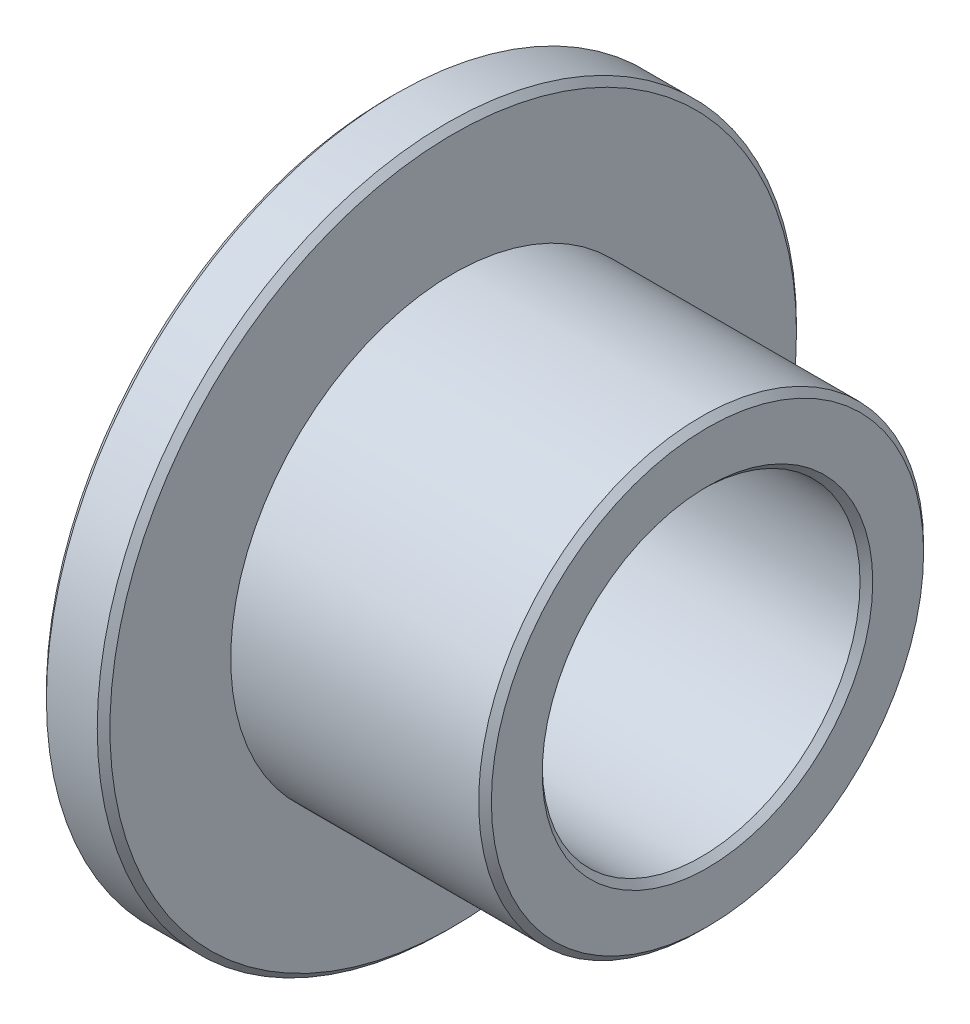
ISO-10303-21;
HEADER;
FILE_DESCRIPTION(('STEP AP214'),'2;1');
FILE_NAME('part.step','',(''),(''),'','','');
FILE_SCHEMA(('AUTOMOTIVE_DESIGN { 1 0 10303 214 1 1 1 1 }'));
ENDSEC;
DATA;
#1=APPLICATION_CONTEXT('core data for automotive mechanical design processes');
#2=APPLICATION_PROTOCOL_DEFINITION('international standard','automotive_design',2000,#1);
#3=PRODUCT_CONTEXT('',#1,'mechanical');
#4=PRODUCT('Part','Part','',(#3));
#5=PRODUCT_RELATED_PRODUCT_CATEGORY('part','',(#4));
#6=PRODUCT_DEFINITION_FORMATION('','',#4);
#7=PRODUCT_DEFINITION_CONTEXT('part definition',#1,'design');
#8=PRODUCT_DEFINITION('design','',#6,#7);
#9=PRODUCT_DEFINITION_SHAPE('','',#8);
#10=(LENGTH_UNIT() NAMED_UNIT(*) SI_UNIT(.MILLI.,.METRE.));
#11=(NAMED_UNIT(*) PLANE_ANGLE_UNIT() SI_UNIT($,.RADIAN.));
#12=(NAMED_UNIT(*) SI_UNIT($,.STERADIAN.) SOLID_ANGLE_UNIT());
#13=UNCERTAINTY_MEASURE_WITH_UNIT(LENGTH_MEASURE(1.E-05),#10,'distance_accuracy_value','');
#14=(GEOMETRIC_REPRESENTATION_CONTEXT(3) GLOBAL_UNCERTAINTY_ASSIGNED_CONTEXT((#13)) GLOBAL_UNIT_ASSIGNED_CONTEXT((#10,
#11,#12)) REPRESENTATION_CONTEXT('',''));
#15=CARTESIAN_POINT('',(0.,0.,0.));
#16=DIRECTION('',(0.,0.,1.));
#17=DIRECTION('',(1.,0.,0.));
#18=AXIS2_PLACEMENT_3D('',#15,#16,#17);
#19=CARTESIAN_POINT('',(2.,0.,0.));
#20=DIRECTION('',(-1.,0.,0.));
#21=DIRECTION('',(0.,0.,1.));
#22=AXIS2_PLACEMENT_3D('',#19,#20,#21);
#23=CYLINDRICAL_SURFACE('',#22,11.);
#24=CARTESIAN_POINT('',(1.8,0.,0.));
#25=DIRECTION('',(1.,0.,0.));
#26=DIRECTION('',(0.,0.,-1.));
#27=AXIS2_PLACEMENT_3D('',#24,#25,#26);
#28=CIRCLE('',#27,11.);
#29=CARTESIAN_POINT('',(1.8,0.,-11.));
#30=VERTEX_POINT('',#29);
#31=EDGE_CURVE('E48',#30,#30,#28,.F.);
#32=ORIENTED_EDGE('',*,*,#31,.T.);
#33=EDGE_LOOP('',(#32));
#34=FACE_BOUND('',#33,.T.);
#35=CARTESIAN_POINT('',(0.200000000000002,0.,0.));
#36=DIRECTION('',(1.,0.,0.));
#37=DIRECTION('',(0.,0.,-1.));
#38=AXIS2_PLACEMENT_3D('',#35,#36,#37);
#39=CIRCLE('',#38,11.);
#40=CARTESIAN_POINT('',(0.200000000000002,0.,-11.));
#41=VERTEX_POINT('',#40);
#42=EDGE_CURVE('E52',#41,#41,#39,.T.);
#43=ORIENTED_EDGE('',*,*,#42,.T.);
#44=EDGE_LOOP('',(#43));
#45=FACE_BOUND('',#44,.T.);
#46=ADVANCED_FACE('F36',(#34,#45),#23,.T.);
#47=CARTESIAN_POINT('',(2.,0.,0.));
#48=DIRECTION('',(1.,0.,0.));
#49=DIRECTION('',(0.,0.,-1.));
#50=AXIS2_PLACEMENT_3D('',#47,#48,#49);
#51=PLANE('',#50);
#52=CARTESIAN_POINT('',(2.,0.,0.));
#53=DIRECTION('',(1.,0.,0.));
#54=DIRECTION('',(0.,0.,-1.));
#55=AXIS2_PLACEMENT_3D('',#52,#53,#54);
#56=CIRCLE('',#55,10.8);
#57=CARTESIAN_POINT('',(2.,0.,-10.8));
#58=VERTEX_POINT('',#57);
#59=EDGE_CURVE('E57',#58,#58,#56,.T.);
#60=ORIENTED_EDGE('',*,*,#59,.T.);
#61=EDGE_LOOP('',(#60));
#62=FACE_BOUND('',#61,.T.);
#63=CARTESIAN_POINT('',(2.,0.,0.));
#64=DIRECTION('',(1.,0.,0.));
#65=DIRECTION('',(0.,0.,-1.));
#66=AXIS2_PLACEMENT_3D('',#63,#64,#65);
#67=CIRCLE('',#66,7.);
#68=CARTESIAN_POINT('',(2.,0.,-7.));
#69=VERTEX_POINT('',#68);
#70=EDGE_CURVE('E75',#69,#69,#67,.T.);
#71=ORIENTED_EDGE('',*,*,#70,.F.);
#72=EDGE_LOOP('',(#71));
#73=FACE_BOUND('',#72,.T.);
#74=ADVANCED_FACE('F81',(#62,#73),#51,.T.);
#75=CARTESIAN_POINT('',(0.,0.,0.));
#76=DIRECTION('',(1.,0.,0.));
#77=DIRECTION('',(0.,0.,-1.));
#78=AXIS2_PLACEMENT_3D('',#75,#76,#77);
#79=PLANE('',#78);
#80=CARTESIAN_POINT('',(0.,0.,0.));
#81=DIRECTION('',(1.,0.,0.));
#82=DIRECTION('',(0.,0.,-1.));
#83=AXIS2_PLACEMENT_3D('',#80,#81,#82);
#84=CIRCLE('',#83,10.8);
#85=CARTESIAN_POINT('',(0.,0.,-10.8));
#86=VERTEX_POINT('',#85);
#87=EDGE_CURVE('E10',#86,#86,#84,.F.);
#88=ORIENTED_EDGE('',*,*,#87,.T.);
#89=EDGE_LOOP('',(#88));
#90=FACE_BOUND('',#89,.T.);
#91=CARTESIAN_POINT('',(0.,0.,0.));
#92=DIRECTION('',(1.,0.,0.));
#93=DIRECTION('',(0.,0.,-1.));
#94=AXIS2_PLACEMENT_3D('',#91,#92,#93);
#95=CIRCLE('',#94,5.2);
#96=CARTESIAN_POINT('',(0.,0.,-5.2));
#97=VERTEX_POINT('',#96);
#98=EDGE_CURVE('E44',#97,#97,#95,.T.);
#99=ORIENTED_EDGE('',*,*,#98,.T.);
#100=EDGE_LOOP('',(#99));
#101=FACE_BOUND('',#100,.T.);
#102=ADVANCED_FACE('F83',(#90,#101),#79,.F.);
#103=CARTESIAN_POINT('',(10.,0.,0.));
#104=DIRECTION('',(-1.,0.,0.));
#105=DIRECTION('',(0.,0.,1.));
#106=AXIS2_PLACEMENT_3D('',#103,#104,#105);
#107=CYLINDRICAL_SURFACE('',#106,7.);
#108=CARTESIAN_POINT('',(9.8,0.,0.));
#109=DIRECTION('',(1.,0.,0.));
#110=DIRECTION('',(0.,0.,-1.));
#111=AXIS2_PLACEMENT_3D('',#108,#109,#110);
#112=CIRCLE('',#111,7.);
#113=CARTESIAN_POINT('',(9.8,0.,-7.));
#114=VERTEX_POINT('',#113);
#115=EDGE_CURVE('E60',#114,#114,#112,.F.);
#116=ORIENTED_EDGE('',*,*,#115,.T.);
#117=EDGE_LOOP('',(#116));
#118=FACE_BOUND('',#117,.T.);
#119=ORIENTED_EDGE('',*,*,#70,.T.);
#120=EDGE_LOOP('',(#119));
#121=FACE_BOUND('',#120,.T.);
#122=ADVANCED_FACE('F79',(#118,#121),#107,.T.);
#123=CARTESIAN_POINT('',(10.,0.,0.));
#124=DIRECTION('',(1.,0.,0.));
#125=DIRECTION('',(0.,0.,-1.));
#126=AXIS2_PLACEMENT_3D('',#123,#124,#125);
#127=PLANE('',#126);
#128=CARTESIAN_POINT('',(10.,0.,0.));
#129=DIRECTION('',(1.,0.,0.));
#130=DIRECTION('',(0.,0.,-1.));
#131=AXIS2_PLACEMENT_3D('',#128,#129,#130);
#132=CIRCLE('',#131,5.2);
#133=CARTESIAN_POINT('',(10.,0.,-5.2));
#134=VERTEX_POINT('',#133);
#135=EDGE_CURVE('E63',#134,#134,#132,.F.);
#136=ORIENTED_EDGE('',*,*,#135,.T.);
#137=EDGE_LOOP('',(#136));
#138=FACE_BOUND('',#137,.T.);
#139=CARTESIAN_POINT('',(10.,0.,0.));
#140=DIRECTION('',(1.,0.,0.));
#141=DIRECTION('',(0.,0.,-1.));
#142=AXIS2_PLACEMENT_3D('',#139,#140,#141);
#143=CIRCLE('',#142,6.8);
#144=CARTESIAN_POINT('',(10.,0.,-6.8));
#145=VERTEX_POINT('',#144);
#146=EDGE_CURVE('E66',#145,#145,#143,.T.);
#147=ORIENTED_EDGE('',*,*,#146,.T.);
#148=EDGE_LOOP('',(#147));
#149=FACE_BOUND('',#148,.T.);
#150=ADVANCED_FACE('F136',(#138,#149),#127,.T.);
#151=CARTESIAN_POINT('',(0.,0.,0.));
#152=DIRECTION('',(1.,0.,0.));
#153=DIRECTION('',(0.,0.,-1.));
#154=AXIS2_PLACEMENT_3D('',#151,#152,#153);
#155=CYLINDRICAL_SURFACE('',#154,5.);
#156=CARTESIAN_POINT('',(9.8,0.,0.));
#157=DIRECTION('',(1.,0.,0.));
#158=DIRECTION('',(0.,0.,-1.));
#159=AXIS2_PLACEMENT_3D('',#156,#157,#158);
#160=CIRCLE('',#159,5.);
#161=CARTESIAN_POINT('',(9.8,0.,-5.));
#162=VERTEX_POINT('',#161);
#163=EDGE_CURVE('E69',#162,#162,#160,.T.);
#164=ORIENTED_EDGE('',*,*,#163,.T.);
#165=EDGE_LOOP('',(#164));
#166=FACE_BOUND('',#165,.T.);
#167=CARTESIAN_POINT('',(0.200000000000001,0.,0.));
#168=DIRECTION('',(1.,0.,0.));
#169=DIRECTION('',(0.,0.,-1.));
#170=AXIS2_PLACEMENT_3D('',#167,#168,#169);
#171=CIRCLE('',#170,5.);
#172=CARTESIAN_POINT('',(0.200000000000001,0.,-5.));
#173=VERTEX_POINT('',#172);
#174=EDGE_CURVE('E72',#173,#173,#171,.F.);
#175=ORIENTED_EDGE('',*,*,#174,.T.);
#176=EDGE_LOOP('',(#175));
#177=FACE_BOUND('',#176,.T.);
#178=ADVANCED_FACE('F104',(#166,#177),#155,.F.);
#179=CARTESIAN_POINT('',(9.8,0.,0.));
#180=DIRECTION('',(1.,0.,0.));
#181=DIRECTION('',(0.,0.,-1.));
#182=AXIS2_PLACEMENT_3D('',#179,#180,#181);
#183=CONICAL_SURFACE('',#182,5.,0.78539816339745);
#184=ORIENTED_EDGE('',*,*,#135,.F.);
#185=EDGE_LOOP('',(#184));
#186=FACE_BOUND('',#185,.T.);
#187=ORIENTED_EDGE('',*,*,#163,.F.);
#188=EDGE_LOOP('',(#187));
#189=FACE_BOUND('',#188,.T.);
#190=ADVANCED_FACE('F97',(#186,#189),#183,.F.);
#191=CARTESIAN_POINT('',(10.,0.,0.));
#192=DIRECTION('',(-1.,0.,0.));
#193=DIRECTION('',(0.,0.,1.));
#194=AXIS2_PLACEMENT_3D('',#191,#192,#193);
#195=CONICAL_SURFACE('',#194,6.8,0.785398163397444);
#196=ORIENTED_EDGE('',*,*,#115,.F.);
#197=EDGE_LOOP('',(#196));
#198=FACE_BOUND('',#197,.T.);
#199=ORIENTED_EDGE('',*,*,#146,.F.);
#200=EDGE_LOOP('',(#199));
#201=FACE_BOUND('',#200,.T.);
#202=ADVANCED_FACE('F103',(#198,#201),#195,.T.);
#203=CARTESIAN_POINT('',(2.,0.,0.));
#204=DIRECTION('',(-1.,0.,0.));
#205=DIRECTION('',(0.,0.,1.));
#206=AXIS2_PLACEMENT_3D('',#203,#204,#205);
#207=CONICAL_SURFACE('',#206,10.8,0.785398163397448);
#208=ORIENTED_EDGE('',*,*,#31,.F.);
#209=EDGE_LOOP('',(#208));
#210=FACE_BOUND('',#209,.T.);
#211=ORIENTED_EDGE('',*,*,#59,.F.);
#212=EDGE_LOOP('',(#211));
#213=FACE_BOUND('',#212,.T.);
#214=ADVANCED_FACE('F111',(#210,#213),#207,.T.);
#215=CARTESIAN_POINT('',(0.200000000000002,0.,0.));
#216=DIRECTION('',(1.,0.,0.));
#217=DIRECTION('',(0.,0.,-1.));
#218=AXIS2_PLACEMENT_3D('',#215,#216,#217);
#219=CONICAL_SURFACE('',#218,11.,0.785398163397448);
#220=ORIENTED_EDGE('',*,*,#87,.F.);
#221=EDGE_LOOP('',(#220));
#222=FACE_BOUND('',#221,.T.);
#223=ORIENTED_EDGE('',*,*,#42,.F.);
#224=EDGE_LOOP('',(#223));
#225=FACE_BOUND('',#224,.T.);
#226=ADVANCED_FACE('F117',(#222,#225),#219,.T.);
#227=CARTESIAN_POINT('',(0.,0.,0.));
#228=DIRECTION('',(-1.,0.,0.));
#229=DIRECTION('',(0.,0.,1.));
#230=AXIS2_PLACEMENT_3D('',#227,#228,#229);
#231=CONICAL_SURFACE('',#230,5.2,0.785398163397446);
#232=ORIENTED_EDGE('',*,*,#174,.F.);
#233=EDGE_LOOP('',(#232));
#234=FACE_BOUND('',#233,.T.);
#235=ORIENTED_EDGE('',*,*,#98,.F.);
#236=EDGE_LOOP('',(#235));
#237=FACE_BOUND('',#236,.T.);
#238=ADVANCED_FACE('F39',(#234,#237),#231,.F.);
#239=CLOSED_SHELL('',(#46,#74,#102,#122,#150,#178,#190,#202,#214,#226,#238));
#240=MANIFOLD_SOLID_BREP('B2',#239);
#241=ADVANCED_BREP_SHAPE_REPRESENTATION('',(#18,#240),#14);
#242=SHAPE_DEFINITION_REPRESENTATION(#9,#241);
ENDSEC;
END-ISO-10303-21;
